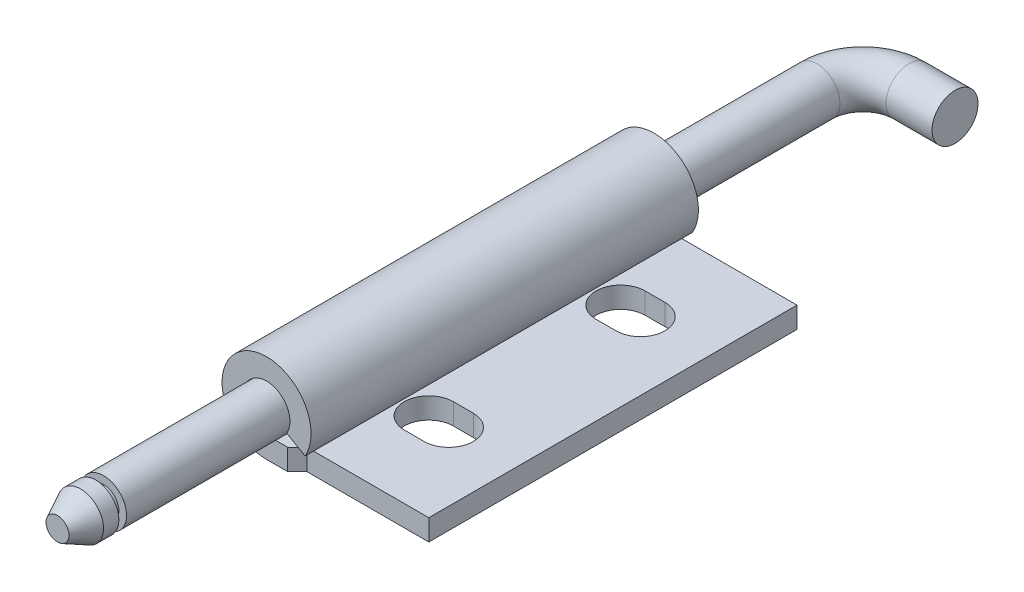
ISO-10303-21;
HEADER;
FILE_DESCRIPTION(('STEP AP214'),'2;1');
FILE_NAME('part.step','',(''),(''),'','','');
FILE_SCHEMA(('AUTOMOTIVE_DESIGN { 1 0 10303 214 1 1 1 1 }'));
ENDSEC;
DATA;
#1=APPLICATION_CONTEXT('core data for automotive mechanical design processes');
#2=APPLICATION_PROTOCOL_DEFINITION('international standard','automotive_design',2000,#1);
#3=PRODUCT_CONTEXT('',#1,'mechanical');
#4=PRODUCT('Part','Part','',(#3));
#5=PRODUCT_RELATED_PRODUCT_CATEGORY('part','',(#4));
#6=PRODUCT_DEFINITION_FORMATION('','',#4);
#7=PRODUCT_DEFINITION_CONTEXT('part definition',#1,'design');
#8=PRODUCT_DEFINITION('design','',#6,#7);
#9=PRODUCT_DEFINITION_SHAPE('','',#8);
#10=(LENGTH_UNIT() NAMED_UNIT(*) SI_UNIT(.MILLI.,.METRE.));
#11=(NAMED_UNIT(*) PLANE_ANGLE_UNIT() SI_UNIT($,.RADIAN.));
#12=(NAMED_UNIT(*) SI_UNIT($,.STERADIAN.) SOLID_ANGLE_UNIT());
#13=UNCERTAINTY_MEASURE_WITH_UNIT(LENGTH_MEASURE(1.E-05),#10,'distance_accuracy_value','');
#14=(GEOMETRIC_REPRESENTATION_CONTEXT(3) GLOBAL_UNCERTAINTY_ASSIGNED_CONTEXT((#13)) GLOBAL_UNIT_ASSIGNED_CONTEXT((#10,
#11,#12)) REPRESENTATION_CONTEXT('',''));
#15=CARTESIAN_POINT('',(0.,0.,0.));
#16=DIRECTION('',(0.,0.,1.));
#17=DIRECTION('',(1.,0.,0.));
#18=AXIS2_PLACEMENT_3D('',#15,#16,#17);
#19=CARTESIAN_POINT('',(0.,0.,52.5));
#20=DIRECTION('',(0.,0.,-1.));
#21=DIRECTION('',(-1.,0.,0.));
#22=AXIS2_PLACEMENT_3D('',#19,#20,#21);
#23=PLANE('',#22);
#24=CARTESIAN_POINT('',(0.,0.,52.5000000000091));
#25=DIRECTION('',(0.,0.,-1.));
#26=DIRECTION('',(-1.,0.,0.));
#27=AXIS2_PLACEMENT_3D('',#24,#25,#26);
#28=CIRCLE('',#27,1.49999999996453);
#29=CARTESIAN_POINT('',(-1.49999999996453,0.,52.5000000000091));
#30=VERTEX_POINT('',#29);
#31=EDGE_CURVE('E20',#30,#30,#28,.T.);
#32=ORIENTED_EDGE('',*,*,#31,.F.);
#33=EDGE_LOOP('',(#32));
#34=FACE_BOUND('',#33,.T.);
#35=ADVANCED_FACE('F16',(#34),#23,.F.);
#36=CARTESIAN_POINT('',(0.,0.,49.5000000002506));
#37=DIRECTION('',(0.,0.,-1.));
#38=DIRECTION('',(-1.,0.,0.));
#39=AXIS2_PLACEMENT_3D('',#36,#37,#38);
#40=CONICAL_SURFACE('',#39,2.99999999984379,0.463647609000806);
#41=CARTESIAN_POINT('',(0.,0.,49.5));
#42=DIRECTION('',(0.,0.,1.));
#43=DIRECTION('',(1.,0.,0.));
#44=AXIS2_PLACEMENT_3D('',#41,#42,#43);
#45=CIRCLE('',#44,3.);
#46=CARTESIAN_POINT('',(3.,0.,49.5));
#47=VERTEX_POINT('',#46);
#48=EDGE_CURVE('E180',#47,#47,#45,.F.);
#49=ORIENTED_EDGE('',*,*,#48,.F.);
#50=EDGE_LOOP('',(#49));
#51=FACE_BOUND('',#50,.T.);
#52=ORIENTED_EDGE('',*,*,#31,.T.);
#53=EDGE_LOOP('',(#52));
#54=FACE_BOUND('',#53,.T.);
#55=ADVANCED_FACE('F560',(#51,#54),#40,.T.);
#56=CARTESIAN_POINT('',(0.,0.,-46.5));
#57=DIRECTION('',(0.,0.,1.));
#58=DIRECTION('',(1.,0.,0.));
#59=AXIS2_PLACEMENT_3D('',#56,#57,#58);
#60=CYLINDRICAL_SURFACE('',#59,3.);
#61=ORIENTED_EDGE('',*,*,#48,.T.);
#62=EDGE_LOOP('',(#61));
#63=FACE_BOUND('',#62,.T.);
#64=CARTESIAN_POINT('',(0.,0.,47.5));
#65=DIRECTION('',(0.,0.,1.));
#66=DIRECTION('',(1.,0.,0.));
#67=AXIS2_PLACEMENT_3D('',#64,#65,#66);
#68=CIRCLE('',#67,3.);
#69=CARTESIAN_POINT('',(3.,0.,47.5));
#70=VERTEX_POINT('',#69);
#71=EDGE_CURVE('E182',#70,#70,#68,.T.);
#72=ORIENTED_EDGE('',*,*,#71,.T.);
#73=EDGE_LOOP('',(#72));
#74=FACE_BOUND('',#73,.T.);
#75=ADVANCED_FACE('F242',(#63,#74),#60,.T.);
#76=CARTESIAN_POINT('',(-3.,0.,47.5));
#77=DIRECTION('',(0.,0.,1.));
#78=DIRECTION('',(1.,0.,0.));
#79=AXIS2_PLACEMENT_3D('',#76,#77,#78);
#80=PLANE('',#79);
#81=ORIENTED_EDGE('',*,*,#71,.F.);
#82=EDGE_LOOP('',(#81));
#83=FACE_BOUND('',#82,.T.);
#84=CARTESIAN_POINT('',(0.,0.,47.5));
#85=DIRECTION('',(0.,0.,1.));
#86=DIRECTION('',(1.,0.,0.));
#87=AXIS2_PLACEMENT_3D('',#84,#85,#86);
#88=CIRCLE('',#87,2.);
#89=CARTESIAN_POINT('',(2.,0.,47.5));
#90=VERTEX_POINT('',#89);
#91=EDGE_CURVE('E237',#90,#90,#88,.F.);
#92=ORIENTED_EDGE('',*,*,#91,.F.);
#93=EDGE_LOOP('',(#92));
#94=FACE_BOUND('',#93,.T.);
#95=ADVANCED_FACE('F244',(#83,#94),#80,.F.);
#96=CARTESIAN_POINT('',(12.,0.,-52.5));
#97=DIRECTION('',(1.,0.,0.));
#98=DIRECTION('',(0.,0.,-1.));
#99=AXIS2_PLACEMENT_3D('',#96,#97,#98);
#100=PLANE('',#99);
#101=CARTESIAN_POINT('',(12.,0.,-52.5));
#102=DIRECTION('',(-1.,0.,0.));
#103=DIRECTION('',(0.,0.,1.));
#104=AXIS2_PLACEMENT_3D('',#101,#102,#103);
#105=CIRCLE('',#104,3.);
#106=CARTESIAN_POINT('',(12.,0.,-49.5));
#107=VERTEX_POINT('',#106);
#108=EDGE_CURVE('E234',#107,#107,#105,.T.);
#109=ORIENTED_EDGE('',*,*,#108,.F.);
#110=EDGE_LOOP('',(#109));
#111=FACE_BOUND('',#110,.T.);
#112=ADVANCED_FACE('F247',(#111),#100,.T.);
#113=CARTESIAN_POINT('',(0.,0.,-46.5));
#114=DIRECTION('',(0.,0.,1.));
#115=DIRECTION('',(1.,0.,0.));
#116=AXIS2_PLACEMENT_3D('',#113,#114,#115);
#117=CYLINDRICAL_SURFACE('',#116,2.);
#118=ORIENTED_EDGE('',*,*,#91,.T.);
#119=EDGE_LOOP('',(#118));
#120=FACE_BOUND('',#119,.T.);
#121=CARTESIAN_POINT('',(0.,0.,46.5));
#122=DIRECTION('',(0.,0.,1.));
#123=DIRECTION('',(1.,0.,0.));
#124=AXIS2_PLACEMENT_3D('',#121,#122,#123);
#125=CIRCLE('',#124,2.);
#126=CARTESIAN_POINT('',(2.,0.,46.5));
#127=VERTEX_POINT('',#126);
#128=EDGE_CURVE('E179',#127,#127,#125,.T.);
#129=ORIENTED_EDGE('',*,*,#128,.T.);
#130=EDGE_LOOP('',(#129));
#131=FACE_BOUND('',#130,.T.);
#132=ADVANCED_FACE('F251',(#120,#131),#117,.T.);
#133=CARTESIAN_POINT('',(12.,0.,-52.5));
#134=DIRECTION('',(-1.,0.,0.));
#135=DIRECTION('',(0.,0.,1.));
#136=AXIS2_PLACEMENT_3D('',#133,#134,#135);
#137=CYLINDRICAL_SURFACE('',#136,3.);
#138=CARTESIAN_POINT('',(6.,0.,-52.5));
#139=DIRECTION('',(-1.,0.,0.));
#140=DIRECTION('',(0.,0.,1.));
#141=AXIS2_PLACEMENT_3D('',#138,#139,#140);
#142=CIRCLE('',#141,3.);
#143=CARTESIAN_POINT('',(6.,0.,-55.5));
#144=VERTEX_POINT('',#143);
#145=EDGE_CURVE('E173',#144,#144,#142,.T.);
#146=ORIENTED_EDGE('',*,*,#145,.F.);
#147=EDGE_LOOP('',(#146));
#148=FACE_BOUND('',#147,.T.);
#149=ORIENTED_EDGE('',*,*,#108,.T.);
#150=EDGE_LOOP('',(#149));
#151=FACE_BOUND('',#150,.T.);
#152=ADVANCED_FACE('F254',(#148,#151),#137,.T.);
#153=CARTESIAN_POINT('',(-2.,0.,46.5));
#154=DIRECTION('',(0.,0.,-1.));
#155=DIRECTION('',(-1.,0.,0.));
#156=AXIS2_PLACEMENT_3D('',#153,#154,#155);
#157=PLANE('',#156);
#158=ORIENTED_EDGE('',*,*,#128,.F.);
#159=EDGE_LOOP('',(#158));
#160=FACE_BOUND('',#159,.T.);
#161=CARTESIAN_POINT('',(0.,0.,46.5));
#162=DIRECTION('',(0.,0.,1.));
#163=DIRECTION('',(1.,0.,0.));
#164=AXIS2_PLACEMENT_3D('',#161,#162,#163);
#165=CIRCLE('',#164,3.);
#166=CARTESIAN_POINT('',(3.,0.,46.5));
#167=VERTEX_POINT('',#166);
#168=EDGE_CURVE('E172',#167,#167,#165,.F.);
#169=ORIENTED_EDGE('',*,*,#168,.F.);
#170=EDGE_LOOP('',(#169));
#171=FACE_BOUND('',#170,.T.);
#172=ADVANCED_FACE('F258',(#160,#171),#157,.F.);
#173=CARTESIAN_POINT('',(6.,0.,-46.5));
#174=DIRECTION('',(0.,1.,0.));
#175=DIRECTION('',(-1.,0.,0.));
#176=AXIS2_PLACEMENT_3D('',#173,#174,#175);
#177=TOROIDAL_SURFACE('',#176,5.99999999999999,3.);
#178=CARTESIAN_POINT('',(0.,0.,-46.5));
#179=DIRECTION('',(0.,0.,1.));
#180=DIRECTION('',(1.,0.,0.));
#181=AXIS2_PLACEMENT_3D('',#178,#179,#180);
#182=CIRCLE('',#181,3.);
#183=CARTESIAN_POINT('',(-3.,0.,-46.5));
#184=VERTEX_POINT('',#183);
#185=EDGE_CURVE('E174',#184,#184,#182,.T.);
#186=CARTESIAN_POINT('',(6.,0.,-46.5));
#187=DIRECTION('',(0.,1.,0.));
#188=DIRECTION('',(-1.,0.,0.));
#189=AXIS2_PLACEMENT_3D('',#186,#187,#188);
#190=CIRCLE('',#189,8.99999999999999);
#191=EDGE_CURVE('',#144,#184,#190,.T.);
#192=ORIENTED_EDGE('',*,*,#145,.T.);
#193=ORIENTED_EDGE('',*,*,#185,.F.);
#194=ORIENTED_EDGE('',*,*,#191,.T.);
#195=ORIENTED_EDGE('',*,*,#191,.F.);
#196=EDGE_LOOP('',(#192,#194,#193,#195));
#197=FACE_BOUND('',#196,.T.);
#198=ADVANCED_FACE('F18',(#197),#177,.T.);
#199=CARTESIAN_POINT('',(0.,0.,-46.5));
#200=DIRECTION('',(0.,0.,1.));
#201=DIRECTION('',(1.,0.,0.));
#202=AXIS2_PLACEMENT_3D('',#199,#200,#201);
#203=CYLINDRICAL_SURFACE('',#202,3.);
#204=ORIENTED_EDGE('',*,*,#168,.T.);
#205=EDGE_LOOP('',(#204));
#206=FACE_BOUND('',#205,.T.);
#207=DIRECTION('',(0.,0.,1.));
#208=VECTOR('',#207,1.);
#209=CARTESIAN_POINT('',(0.,-3.,0.1));
#210=LINE('',#209,#208);
#211=CARTESIAN_POINT('',(0.,-3.,0.100000000000001));
#212=VERTEX_POINT('',#211);
#213=CARTESIAN_POINT('',(0.,-3.,-0.100000000000001));
#214=VERTEX_POINT('',#213);
#215=EDGE_CURVE('E143',#212,#214,#210,.F.);
#216=ORIENTED_EDGE('',*,*,#215,.T.);
#217=CARTESIAN_POINT('',(0.,0.,-0.100000000000003));
#218=DIRECTION('',(0.,0.,1.));
#219=DIRECTION('',(1.,0.,0.));
#220=AXIS2_PLACEMENT_3D('',#217,#218,#219);
#221=CIRCLE('',#220,3.);
#222=CARTESIAN_POINT('',(2.59807621135332,-1.5,-0.100000000000002));
#223=VERTEX_POINT('',#222);
#224=EDGE_CURVE('E163',#214,#223,#221,.F.);
#225=ORIENTED_EDGE('',*,*,#224,.T.);
#226=DIRECTION('',(0.,0.,1.));
#227=VECTOR('',#226,1.);
#228=CARTESIAN_POINT('',(2.59807621135332,-1.5,-46.5));
#229=LINE('',#228,#227);
#230=CARTESIAN_POINT('',(2.59807621135332,-1.5,0.0999999999999987));
#231=VERTEX_POINT('',#230);
#232=EDGE_CURVE('E146',#223,#231,#229,.T.);
#233=ORIENTED_EDGE('',*,*,#232,.T.);
#234=CARTESIAN_POINT('',(0.,0.,0.0999999999999959));
#235=DIRECTION('',(0.,0.,1.));
#236=DIRECTION('',(1.,0.,0.));
#237=AXIS2_PLACEMENT_3D('',#234,#235,#236);
#238=CIRCLE('',#237,3.);
#239=EDGE_CURVE('E137',#212,#231,#238,.F.);
#240=ORIENTED_EDGE('',*,*,#239,.F.);
#241=EDGE_LOOP('',(#216,#225,#233,#240));
#242=FACE_BOUND('',#241,.T.);
#243=ORIENTED_EDGE('',*,*,#185,.T.);
#244=EDGE_LOOP('',(#243));
#245=FACE_BOUND('',#244,.T.);
#246=ADVANCED_FACE('F139',(#206,#242,#245),#203,.T.);
#247=CARTESIAN_POINT('',(0.,0.,0.1));
#248=DIRECTION('',(0.,0.,1.));
#249=DIRECTION('',(1.,0.,0.));
#250=AXIS2_PLACEMENT_3D('',#247,#248,#249);
#251=PLANE('',#250);
#252=DIRECTION('',(0.,1.,0.));
#253=VECTOR('',#252,1.);
#254=CARTESIAN_POINT('',(0.,-5.8,0.0999999999999994));
#255=LINE('',#254,#253);
#256=CARTESIAN_POINT('',(0.,-3.05,0.0999999999999994));
#257=VERTEX_POINT('',#256);
#258=EDGE_CURVE('E149',#257,#212,#255,.T.);
#259=ORIENTED_EDGE('',*,*,#258,.T.);
#260=ORIENTED_EDGE('',*,*,#239,.T.);
#261=DIRECTION('',(0.866025403784438,-0.5,0.));
#262=VECTOR('',#261,1.);
#263=CARTESIAN_POINT('',(2.59807621135332,-1.5,0.1));
#264=LINE('',#263,#262);
#265=CARTESIAN_POINT('',(2.64137748154254,-1.525,0.0999999999999995));
#266=VERTEX_POINT('',#265);
#267=EDGE_CURVE('E150',#231,#266,#264,.T.);
#268=ORIENTED_EDGE('',*,*,#267,.T.);
#269=CARTESIAN_POINT('',(0.,0.,0.0999999999999994));
#270=DIRECTION('',(0.,0.,-1.));
#271=DIRECTION('',(-1.,0.,0.));
#272=AXIS2_PLACEMENT_3D('',#269,#270,#271);
#273=CIRCLE('',#272,3.05);
#274=EDGE_CURVE('E154',#266,#257,#273,.F.);
#275=ORIENTED_EDGE('',*,*,#274,.T.);
#276=EDGE_LOOP('',(#259,#260,#268,#275));
#277=FACE_BOUND('',#276,.T.);
#278=ADVANCED_FACE('F153',(#277),#251,.T.);
#279=CARTESIAN_POINT('',(0.,-5.8,0.1));
#280=DIRECTION('',(-1.,0.,0.));
#281=DIRECTION('',(0.,0.,1.));
#282=AXIS2_PLACEMENT_3D('',#279,#280,#281);
#283=PLANE('',#282);
#284=DIRECTION('',(0.,1.,0.));
#285=VECTOR('',#284,1.);
#286=CARTESIAN_POINT('',(0.,0.,-0.1));
#287=LINE('',#286,#285);
#288=CARTESIAN_POINT('',(0.,-3.05,-0.0999999999999995));
#289=VERTEX_POINT('',#288);
#290=EDGE_CURVE('E162',#289,#214,#287,.T.);
#291=ORIENTED_EDGE('',*,*,#290,.T.);
#292=ORIENTED_EDGE('',*,*,#215,.F.);
#293=ORIENTED_EDGE('',*,*,#258,.F.);
#294=DIRECTION('',(0.,0.,1.));
#295=VECTOR('',#294,1.);
#296=CARTESIAN_POINT('',(0.,-3.05,25.25));
#297=LINE('',#296,#295);
#298=EDGE_CURVE('E618',#257,#289,#297,.F.);
#299=ORIENTED_EDGE('',*,*,#298,.T.);
#300=EDGE_LOOP('',(#291,#292,#293,#299));
#301=FACE_BOUND('',#300,.T.);
#302=ADVANCED_FACE('F160',(#301),#283,.F.);
#303=CARTESIAN_POINT('',(0.,0.,-0.1));
#304=DIRECTION('',(0.,0.,1.));
#305=DIRECTION('',(1.,0.,0.));
#306=AXIS2_PLACEMENT_3D('',#303,#304,#305);
#307=PLANE('',#306);
#308=ORIENTED_EDGE('',*,*,#290,.F.);
#309=CARTESIAN_POINT('',(0.,0.,-0.0999999999999994));
#310=DIRECTION('',(0.,0.,-1.));
#311=DIRECTION('',(-1.,0.,0.));
#312=AXIS2_PLACEMENT_3D('',#309,#310,#311);
#313=CIRCLE('',#312,3.05);
#314=CARTESIAN_POINT('',(2.64137748154254,-1.525,-0.0999999999999995));
#315=VERTEX_POINT('',#314);
#316=EDGE_CURVE('E207',#289,#315,#313,.T.);
#317=ORIENTED_EDGE('',*,*,#316,.T.);
#318=DIRECTION('',(0.866025403784446,-0.499999999999986,0.));
#319=VECTOR('',#318,1.);
#320=CARTESIAN_POINT('',(2.59807621135332,-1.5,-0.1));
#321=LINE('',#320,#319);
#322=EDGE_CURVE('E165',#223,#315,#321,.T.);
#323=ORIENTED_EDGE('',*,*,#322,.F.);
#324=ORIENTED_EDGE('',*,*,#224,.F.);
#325=EDGE_LOOP('',(#308,#317,#323,#324));
#326=FACE_BOUND('',#325,.T.);
#327=ADVANCED_FACE('F358',(#326),#307,.F.);
#328=CARTESIAN_POINT('',(4.,-9.00000000000001,24.));
#329=DIRECTION('',(0.,0.,1.));
#330=DIRECTION('',(1.,0.,0.));
#331=AXIS2_PLACEMENT_3D('',#328,#329,#330);
#332=PLANE('',#331);
#333=DIRECTION('',(-1.,0.,0.));
#334=VECTOR('',#333,1.);
#335=CARTESIAN_POINT('',(0.,-5.8,24.));
#336=LINE('',#335,#334);
#337=CARTESIAN_POINT('',(4.,-5.8,24.));
#338=VERTEX_POINT('',#337);
#339=CARTESIAN_POINT('',(19.9,-5.8,24.));
#340=VERTEX_POINT('',#339);
#341=EDGE_CURVE('E648',#338,#340,#336,.F.);
#342=ORIENTED_EDGE('',*,*,#341,.T.);
#343=DIRECTION('',(0.,1.,0.));
#344=VECTOR('',#343,1.);
#345=CARTESIAN_POINT('',(19.9,-5.80000000000001,24.));
#346=LINE('',#345,#344);
#347=CARTESIAN_POINT('',(19.9,-3.05000000000001,24.));
#348=VERTEX_POINT('',#347);
#349=EDGE_CURVE('E608',#340,#348,#346,.T.);
#350=ORIENTED_EDGE('',*,*,#349,.T.);
#351=DIRECTION('',(1.,0.,0.));
#352=VECTOR('',#351,1.);
#353=CARTESIAN_POINT('',(19.9,-3.05000000000001,24.));
#354=LINE('',#353,#352);
#355=CARTESIAN_POINT('',(4.,-3.05,24.));
#356=VERTEX_POINT('',#355);
#357=EDGE_CURVE('E621',#348,#356,#354,.F.);
#358=ORIENTED_EDGE('',*,*,#357,.T.);
#359=DIRECTION('',(0.,1.,0.));
#360=VECTOR('',#359,1.);
#361=CARTESIAN_POINT('',(4.,-9.00000000000001,24.));
#362=LINE('',#361,#360);
#363=EDGE_CURVE('E227',#338,#356,#362,.T.);
#364=ORIENTED_EDGE('',*,*,#363,.F.);
#365=EDGE_LOOP('',(#342,#350,#358,#364));
#366=FACE_BOUND('',#365,.T.);
#367=ADVANCED_FACE('F354',(#366),#332,.T.);
#368=CARTESIAN_POINT('',(19.9,-5.80000000000001,25.25));
#369=DIRECTION('',(-1.,0.,0.));
#370=DIRECTION('',(0.,0.,1.));
#371=AXIS2_PLACEMENT_3D('',#368,#369,#370);
#372=PLANE('',#371);
#373=ORIENTED_EDGE('',*,*,#349,.F.);
#374=DIRECTION('',(0.,0.,1.));
#375=VECTOR('',#374,1.);
#376=CARTESIAN_POINT('',(19.9,-5.80000000000001,25.25));
#377=LINE('',#376,#375);
#378=CARTESIAN_POINT('',(19.9,-5.80000000000001,-24.));
#379=VERTEX_POINT('',#378);
#380=EDGE_CURVE('E645',#340,#379,#377,.F.);
#381=ORIENTED_EDGE('',*,*,#380,.T.);
#382=DIRECTION('',(0.,1.,0.));
#383=VECTOR('',#382,1.);
#384=CARTESIAN_POINT('',(19.9,-9.00000000000001,-24.));
#385=LINE('',#384,#383);
#386=CARTESIAN_POINT('',(19.9,-3.05,-24.));
#387=VERTEX_POINT('',#386);
#388=EDGE_CURVE('E611',#387,#379,#385,.F.);
#389=ORIENTED_EDGE('',*,*,#388,.F.);
#390=DIRECTION('',(0.,0.,1.));
#391=VECTOR('',#390,1.);
#392=CARTESIAN_POINT('',(19.9,-3.05000000000001,25.25));
#393=LINE('',#392,#391);
#394=EDGE_CURVE('E625',#387,#348,#393,.T.);
#395=ORIENTED_EDGE('',*,*,#394,.T.);
#396=EDGE_LOOP('',(#373,#381,#389,#395));
#397=FACE_BOUND('',#396,.T.);
#398=ADVANCED_FACE('F350',(#397),#372,.F.);
#399=CARTESIAN_POINT('',(19.9,-9.00000000000001,-24.));
#400=DIRECTION('',(0.,0.,-1.));
#401=DIRECTION('',(-1.,0.,0.));
#402=AXIS2_PLACEMENT_3D('',#399,#400,#401);
#403=PLANE('',#402);
#404=DIRECTION('',(-1.,0.,0.));
#405=VECTOR('',#404,1.);
#406=CARTESIAN_POINT('',(0.,-5.8,-24.));
#407=LINE('',#406,#405);
#408=CARTESIAN_POINT('',(4.,-5.8,-24.));
#409=VERTEX_POINT('',#408);
#410=EDGE_CURVE('E647',#379,#409,#407,.T.);
#411=ORIENTED_EDGE('',*,*,#410,.T.);
#412=DIRECTION('',(0.,1.,0.));
#413=VECTOR('',#412,1.);
#414=CARTESIAN_POINT('',(4.,-9.00000000000001,-24.));
#415=LINE('',#414,#413);
#416=CARTESIAN_POINT('',(4.,-3.05,-24.));
#417=VERTEX_POINT('',#416);
#418=EDGE_CURVE('E667',#417,#409,#415,.F.);
#419=ORIENTED_EDGE('',*,*,#418,.F.);
#420=DIRECTION('',(1.,0.,0.));
#421=VECTOR('',#420,1.);
#422=CARTESIAN_POINT('',(19.9,-3.05000000000001,-24.));
#423=LINE('',#422,#421);
#424=EDGE_CURVE('E630',#417,#387,#423,.T.);
#425=ORIENTED_EDGE('',*,*,#424,.T.);
#426=ORIENTED_EDGE('',*,*,#388,.T.);
#427=EDGE_LOOP('',(#411,#419,#425,#426));
#428=FACE_BOUND('',#427,.T.);
#429=ADVANCED_FACE('F346',(#428),#403,.T.);
#430=CARTESIAN_POINT('',(11.,-9.00000000000001,9.3));
#431=DIRECTION('',(0.,0.,-1.));
#432=DIRECTION('',(-1.,0.,0.));
#433=AXIS2_PLACEMENT_3D('',#430,#431,#432);
#434=PLANE('',#433);
#435=DIRECTION('',(0.,1.,0.));
#436=VECTOR('',#435,1.);
#437=CARTESIAN_POINT('',(8.4,-9.00000000000001,9.3));
#438=LINE('',#437,#436);
#439=CARTESIAN_POINT('',(8.4,-3.05,9.3));
#440=VERTEX_POINT('',#439);
#441=CARTESIAN_POINT('',(8.4,-5.8,9.3));
#442=VERTEX_POINT('',#441);
#443=EDGE_CURVE('E682',#440,#442,#438,.F.);
#444=ORIENTED_EDGE('',*,*,#443,.T.);
#445=DIRECTION('',(-1.,0.,0.));
#446=VECTOR('',#445,1.);
#447=CARTESIAN_POINT('',(0.,-5.8,9.3));
#448=LINE('',#447,#446);
#449=CARTESIAN_POINT('',(11.,-5.8,9.3));
#450=VERTEX_POINT('',#449);
#451=EDGE_CURVE('E206',#442,#450,#448,.F.);
#452=ORIENTED_EDGE('',*,*,#451,.T.);
#453=DIRECTION('',(0.,1.,0.));
#454=VECTOR('',#453,1.);
#455=CARTESIAN_POINT('',(11.,-9.00000000000001,9.3));
#456=LINE('',#455,#454);
#457=CARTESIAN_POINT('',(11.,-3.05,9.3));
#458=VERTEX_POINT('',#457);
#459=EDGE_CURVE('E642',#450,#458,#456,.T.);
#460=ORIENTED_EDGE('',*,*,#459,.T.);
#461=DIRECTION('',(1.,0.,0.));
#462=VECTOR('',#461,1.);
#463=CARTESIAN_POINT('',(19.9,-3.05000000000001,9.3));
#464=LINE('',#463,#462);
#465=EDGE_CURVE('E222',#458,#440,#464,.F.);
#466=ORIENTED_EDGE('',*,*,#465,.T.);
#467=EDGE_LOOP('',(#444,#452,#460,#466));
#468=FACE_BOUND('',#467,.T.);
#469=ADVANCED_FACE('F342',(#468),#434,.F.);
#470=CARTESIAN_POINT('',(11.,-9.00000000000001,12.5));
#471=DIRECTION('',(0.,1.,0.));
#472=DIRECTION('',(0.,0.,1.));
#473=AXIS2_PLACEMENT_3D('',#470,#471,#472);
#474=CYLINDRICAL_SURFACE('',#473,3.2);
#475=ORIENTED_EDGE('',*,*,#459,.F.);
#476=CARTESIAN_POINT('',(11.,-5.8,12.5));
#477=DIRECTION('',(0.,1.,0.));
#478=DIRECTION('',(0.,0.,1.));
#479=AXIS2_PLACEMENT_3D('',#476,#477,#478);
#480=CIRCLE('',#479,3.2);
#481=CARTESIAN_POINT('',(11.,-5.8,15.7));
#482=VERTEX_POINT('',#481);
#483=EDGE_CURVE('E204',#450,#482,#480,.F.);
#484=ORIENTED_EDGE('',*,*,#483,.T.);
#485=DIRECTION('',(0.,1.,0.));
#486=VECTOR('',#485,1.);
#487=CARTESIAN_POINT('',(11.,-9.00000000000001,15.7));
#488=LINE('',#487,#486);
#489=CARTESIAN_POINT('',(11.,-3.05,15.7));
#490=VERTEX_POINT('',#489);
#491=EDGE_CURVE('E680',#482,#490,#488,.T.);
#492=ORIENTED_EDGE('',*,*,#491,.T.);
#493=CARTESIAN_POINT('',(11.,-3.05,12.5));
#494=DIRECTION('',(0.,1.,0.));
#495=DIRECTION('',(0.,0.,1.));
#496=AXIS2_PLACEMENT_3D('',#493,#494,#495);
#497=CIRCLE('',#496,3.2);
#498=EDGE_CURVE('E223',#490,#458,#497,.T.);
#499=ORIENTED_EDGE('',*,*,#498,.T.);
#500=EDGE_LOOP('',(#475,#484,#492,#499));
#501=FACE_BOUND('',#500,.T.);
#502=ADVANCED_FACE('F338',(#501),#474,.F.);
#503=CARTESIAN_POINT('',(8.4,-9.00000000000001,15.7));
#504=DIRECTION('',(0.,0.,1.));
#505=DIRECTION('',(1.,0.,0.));
#506=AXIS2_PLACEMENT_3D('',#503,#504,#505);
#507=PLANE('',#506);
#508=ORIENTED_EDGE('',*,*,#491,.F.);
#509=DIRECTION('',(-1.,0.,0.));
#510=VECTOR('',#509,1.);
#511=CARTESIAN_POINT('',(0.,-5.8,15.7));
#512=LINE('',#511,#510);
#513=CARTESIAN_POINT('',(8.4,-5.8,15.7));
#514=VERTEX_POINT('',#513);
#515=EDGE_CURVE('E203',#482,#514,#512,.T.);
#516=ORIENTED_EDGE('',*,*,#515,.T.);
#517=DIRECTION('',(0.,1.,0.));
#518=VECTOR('',#517,1.);
#519=CARTESIAN_POINT('',(8.4,-9.00000000000001,15.7));
#520=LINE('',#519,#518);
#521=CARTESIAN_POINT('',(8.4,-3.05,15.7));
#522=VERTEX_POINT('',#521);
#523=EDGE_CURVE('E683',#514,#522,#520,.T.);
#524=ORIENTED_EDGE('',*,*,#523,.T.);
#525=DIRECTION('',(1.,0.,0.));
#526=VECTOR('',#525,1.);
#527=CARTESIAN_POINT('',(19.9,-3.05000000000001,15.7));
#528=LINE('',#527,#526);
#529=EDGE_CURVE('E226',#522,#490,#528,.T.);
#530=ORIENTED_EDGE('',*,*,#529,.T.);
#531=EDGE_LOOP('',(#508,#516,#524,#530));
#532=FACE_BOUND('',#531,.T.);
#533=ADVANCED_FACE('F334',(#532),#507,.F.);
#534=CARTESIAN_POINT('',(8.4,-9.00000000000001,12.5));
#535=DIRECTION('',(0.,1.,0.));
#536=DIRECTION('',(0.,0.,1.));
#537=AXIS2_PLACEMENT_3D('',#534,#535,#536);
#538=CYLINDRICAL_SURFACE('',#537,3.2);
#539=ORIENTED_EDGE('',*,*,#523,.F.);
#540=CARTESIAN_POINT('',(8.4,-5.8,12.5));
#541=DIRECTION('',(0.,1.,0.));
#542=DIRECTION('',(0.,0.,1.));
#543=AXIS2_PLACEMENT_3D('',#540,#541,#542);
#544=CIRCLE('',#543,3.2);
#545=EDGE_CURVE('E200',#514,#442,#544,.F.);
#546=ORIENTED_EDGE('',*,*,#545,.T.);
#547=ORIENTED_EDGE('',*,*,#443,.F.);
#548=CARTESIAN_POINT('',(8.4,-3.05,12.5));
#549=DIRECTION('',(0.,1.,0.));
#550=DIRECTION('',(0.,0.,1.));
#551=AXIS2_PLACEMENT_3D('',#548,#549,#550);
#552=CIRCLE('',#551,3.2);
#553=EDGE_CURVE('E219',#440,#522,#552,.T.);
#554=ORIENTED_EDGE('',*,*,#553,.T.);
#555=EDGE_LOOP('',(#539,#546,#547,#554));
#556=FACE_BOUND('',#555,.T.);
#557=ADVANCED_FACE('F330',(#556),#538,.F.);
#558=CARTESIAN_POINT('',(11.,-9.00000000000001,-15.7));
#559=DIRECTION('',(0.,0.,-1.));
#560=DIRECTION('',(-1.,0.,0.));
#561=AXIS2_PLACEMENT_3D('',#558,#559,#560);
#562=PLANE('',#561);
#563=DIRECTION('',(0.,1.,0.));
#564=VECTOR('',#563,1.);
#565=CARTESIAN_POINT('',(8.4,-9.00000000000001,-15.7));
#566=LINE('',#565,#564);
#567=CARTESIAN_POINT('',(8.4,-3.05,-15.7));
#568=VERTEX_POINT('',#567);
#569=CARTESIAN_POINT('',(8.4,-5.8,-15.7));
#570=VERTEX_POINT('',#569);
#571=EDGE_CURVE('E690',#568,#570,#566,.F.);
#572=ORIENTED_EDGE('',*,*,#571,.T.);
#573=DIRECTION('',(-1.,0.,0.));
#574=VECTOR('',#573,1.);
#575=CARTESIAN_POINT('',(0.,-5.8,-15.7));
#576=LINE('',#575,#574);
#577=CARTESIAN_POINT('',(11.,-5.8,-15.7));
#578=VERTEX_POINT('',#577);
#579=EDGE_CURVE('E199',#570,#578,#576,.F.);
#580=ORIENTED_EDGE('',*,*,#579,.T.);
#581=DIRECTION('',(0.,1.,0.));
#582=VECTOR('',#581,1.);
#583=CARTESIAN_POINT('',(11.,-9.00000000000001,-15.7));
#584=LINE('',#583,#582);
#585=CARTESIAN_POINT('',(11.,-3.05,-15.7));
#586=VERTEX_POINT('',#585);
#587=EDGE_CURVE('E685',#578,#586,#584,.T.);
#588=ORIENTED_EDGE('',*,*,#587,.T.);
#589=DIRECTION('',(1.,0.,0.));
#590=VECTOR('',#589,1.);
#591=CARTESIAN_POINT('',(19.9,-3.05000000000001,-15.7));
#592=LINE('',#591,#590);
#593=EDGE_CURVE('E214',#586,#568,#592,.F.);
#594=ORIENTED_EDGE('',*,*,#593,.T.);
#595=EDGE_LOOP('',(#572,#580,#588,#594));
#596=FACE_BOUND('',#595,.T.);
#597=ADVANCED_FACE('F326',(#596),#562,.F.);
#598=CARTESIAN_POINT('',(11.,-9.00000000000001,-12.5));
#599=DIRECTION('',(0.,1.,0.));
#600=DIRECTION('',(0.,0.,1.));
#601=AXIS2_PLACEMENT_3D('',#598,#599,#600);
#602=CYLINDRICAL_SURFACE('',#601,3.2);
#603=ORIENTED_EDGE('',*,*,#587,.F.);
#604=CARTESIAN_POINT('',(11.,-5.8,-12.5));
#605=DIRECTION('',(0.,1.,0.));
#606=DIRECTION('',(0.,0.,1.));
#607=AXIS2_PLACEMENT_3D('',#604,#605,#606);
#608=CIRCLE('',#607,3.2);
#609=CARTESIAN_POINT('',(11.,-5.8,-9.3));
#610=VERTEX_POINT('',#609);
#611=EDGE_CURVE('E197',#578,#610,#608,.F.);
#612=ORIENTED_EDGE('',*,*,#611,.T.);
#613=DIRECTION('',(0.,1.,0.));
#614=VECTOR('',#613,1.);
#615=CARTESIAN_POINT('',(11.,-9.00000000000001,-9.3));
#616=LINE('',#615,#614);
#617=CARTESIAN_POINT('',(11.,-3.05,-9.3));
#618=VERTEX_POINT('',#617);
#619=EDGE_CURVE('E688',#610,#618,#616,.T.);
#620=ORIENTED_EDGE('',*,*,#619,.T.);
#621=CARTESIAN_POINT('',(11.,-3.05,-12.5));
#622=DIRECTION('',(0.,1.,0.));
#623=DIRECTION('',(0.,0.,1.));
#624=AXIS2_PLACEMENT_3D('',#621,#622,#623);
#625=CIRCLE('',#624,3.2);
#626=EDGE_CURVE('E215',#618,#586,#625,.T.);
#627=ORIENTED_EDGE('',*,*,#626,.T.);
#628=EDGE_LOOP('',(#603,#612,#620,#627));
#629=FACE_BOUND('',#628,.T.);
#630=ADVANCED_FACE('F322',(#629),#602,.F.);
#631=CARTESIAN_POINT('',(8.4,-9.00000000000001,-9.3));
#632=DIRECTION('',(0.,0.,1.));
#633=DIRECTION('',(1.,0.,0.));
#634=AXIS2_PLACEMENT_3D('',#631,#632,#633);
#635=PLANE('',#634);
#636=ORIENTED_EDGE('',*,*,#619,.F.);
#637=DIRECTION('',(-1.,0.,0.));
#638=VECTOR('',#637,1.);
#639=CARTESIAN_POINT('',(0.,-5.8,-9.3));
#640=LINE('',#639,#638);
#641=CARTESIAN_POINT('',(8.4,-5.8,-9.3));
#642=VERTEX_POINT('',#641);
#643=EDGE_CURVE('E196',#610,#642,#640,.T.);
#644=ORIENTED_EDGE('',*,*,#643,.T.);
#645=DIRECTION('',(0.,1.,0.));
#646=VECTOR('',#645,1.);
#647=CARTESIAN_POINT('',(8.4,-9.00000000000001,-9.3));
#648=LINE('',#647,#646);
#649=CARTESIAN_POINT('',(8.4,-3.05,-9.3));
#650=VERTEX_POINT('',#649);
#651=EDGE_CURVE('E228',#642,#650,#648,.T.);
#652=ORIENTED_EDGE('',*,*,#651,.T.);
#653=DIRECTION('',(1.,0.,0.));
#654=VECTOR('',#653,1.);
#655=CARTESIAN_POINT('',(19.9,-3.05000000000001,-9.3));
#656=LINE('',#655,#654);
#657=EDGE_CURVE('E218',#650,#618,#656,.T.);
#658=ORIENTED_EDGE('',*,*,#657,.T.);
#659=EDGE_LOOP('',(#636,#644,#652,#658));
#660=FACE_BOUND('',#659,.T.);
#661=ADVANCED_FACE('F318',(#660),#635,.F.);
#662=CARTESIAN_POINT('',(8.4,-9.00000000000001,-12.5));
#663=DIRECTION('',(0.,1.,0.));
#664=DIRECTION('',(0.,0.,1.));
#665=AXIS2_PLACEMENT_3D('',#662,#663,#664);
#666=CYLINDRICAL_SURFACE('',#665,3.2);
#667=ORIENTED_EDGE('',*,*,#651,.F.);
#668=CARTESIAN_POINT('',(8.4,-5.8,-12.5));
#669=DIRECTION('',(0.,1.,0.));
#670=DIRECTION('',(0.,0.,1.));
#671=AXIS2_PLACEMENT_3D('',#668,#669,#670);
#672=CIRCLE('',#671,3.2);
#673=EDGE_CURVE('E193',#642,#570,#672,.F.);
#674=ORIENTED_EDGE('',*,*,#673,.T.);
#675=ORIENTED_EDGE('',*,*,#571,.F.);
#676=CARTESIAN_POINT('',(8.4,-3.05,-12.5));
#677=DIRECTION('',(0.,1.,0.));
#678=DIRECTION('',(0.,0.,1.));
#679=AXIS2_PLACEMENT_3D('',#676,#677,#678);
#680=CIRCLE('',#679,3.2);
#681=EDGE_CURVE('E211',#568,#650,#680,.T.);
#682=ORIENTED_EDGE('',*,*,#681,.T.);
#683=EDGE_LOOP('',(#667,#674,#675,#682));
#684=FACE_BOUND('',#683,.T.);
#685=ADVANCED_FACE('F314',(#684),#666,.F.);
#686=CARTESIAN_POINT('',(0.,0.,25.25));
#687=DIRECTION('',(0.,0.,-1.));
#688=DIRECTION('',(-1.,0.,0.));
#689=AXIS2_PLACEMENT_3D('',#686,#687,#688);
#690=CYLINDRICAL_SURFACE('',#689,3.05);
#691=CARTESIAN_POINT('',(0.,0.,25.25));
#692=DIRECTION('',(0.,0.,-1.));
#693=DIRECTION('',(-1.,0.,0.));
#694=AXIS2_PLACEMENT_3D('',#691,#692,#693);
#695=CIRCLE('',#694,3.05);
#696=CARTESIAN_POINT('',(0.,-3.05,25.25));
#697=VERTEX_POINT('',#696);
#698=CARTESIAN_POINT('',(2.64137748154254,-1.525,25.25));
#699=VERTEX_POINT('',#698);
#700=EDGE_CURVE('E190',#697,#699,#695,.T.);
#701=ORIENTED_EDGE('',*,*,#700,.F.);
#702=DIRECTION('',(0.,0.,1.));
#703=VECTOR('',#702,1.);
#704=CARTESIAN_POINT('',(0.,-3.05,25.25));
#705=LINE('',#704,#703);
#706=EDGE_CURVE('E619',#697,#257,#705,.F.);
#707=ORIENTED_EDGE('',*,*,#706,.T.);
#708=ORIENTED_EDGE('',*,*,#274,.F.);
#709=DIRECTION('',(0.,0.,1.));
#710=VECTOR('',#709,1.);
#711=CARTESIAN_POINT('',(2.64137748154254,-1.525,25.25));
#712=LINE('',#711,#710);
#713=EDGE_CURVE('E209',#266,#699,#712,.T.);
#714=ORIENTED_EDGE('',*,*,#713,.T.);
#715=EDGE_LOOP('',(#701,#707,#708,#714));
#716=FACE_BOUND('',#715,.T.);
#717=ADVANCED_FACE('F310',(#716),#690,.F.);
#718=CARTESIAN_POINT('',(2.75,-9.00000000000001,25.25));
#719=DIRECTION('',(0.707106781186548,0.,0.707106781186547));
#720=DIRECTION('',(0.707106781186547,0.,-0.707106781186548));
#721=AXIS2_PLACEMENT_3D('',#718,#719,#720);
#722=PLANE('',#721);
#723=DIRECTION('',(0.707106781186547,0.,-0.707106781186548));
#724=VECTOR('',#723,1.);
#725=CARTESIAN_POINT('',(2.75,-5.8,25.25));
#726=LINE('',#725,#724);
#727=CARTESIAN_POINT('',(2.75,-5.8,25.25));
#728=VERTEX_POINT('',#727);
#729=EDGE_CURVE('E654',#728,#338,#726,.T.);
#730=ORIENTED_EDGE('',*,*,#729,.T.);
#731=ORIENTED_EDGE('',*,*,#363,.T.);
#732=DIRECTION('',(-0.707106781186546,0.,0.707106781186548));
#733=VECTOR('',#732,1.);
#734=CARTESIAN_POINT('',(4.,-3.05,24.));
#735=LINE('',#734,#733);
#736=CARTESIAN_POINT('',(2.75,-3.05,25.25));
#737=VERTEX_POINT('',#736);
#738=EDGE_CURVE('E624',#356,#737,#735,.T.);
#739=ORIENTED_EDGE('',*,*,#738,.T.);
#740=DIRECTION('',(0.,1.,0.));
#741=VECTOR('',#740,1.);
#742=CARTESIAN_POINT('',(2.75,0.,25.25));
#743=LINE('',#742,#741);
#744=EDGE_CURVE('E700',#728,#737,#743,.T.);
#745=ORIENTED_EDGE('',*,*,#744,.F.);
#746=EDGE_LOOP('',(#730,#731,#739,#745));
#747=FACE_BOUND('',#746,.T.);
#748=ADVANCED_FACE('F306',(#747),#722,.T.);
#749=CARTESIAN_POINT('',(4.,-9.00000000000001,-24.));
#750=DIRECTION('',(0.707106781186548,0.,-0.707106781186547));
#751=DIRECTION('',(-0.707106781186547,0.,-0.707106781186548));
#752=AXIS2_PLACEMENT_3D('',#749,#750,#751);
#753=PLANE('',#752);
#754=DIRECTION('',(-0.707106781186547,0.,-0.707106781186547));
#755=VECTOR('',#754,1.);
#756=CARTESIAN_POINT('',(4.,-5.8,-24.));
#757=LINE('',#756,#755);
#758=CARTESIAN_POINT('',(2.75,-5.8,-25.25));
#759=VERTEX_POINT('',#758);
#760=EDGE_CURVE('E659',#409,#759,#757,.T.);
#761=ORIENTED_EDGE('',*,*,#760,.T.);
#762=DIRECTION('',(0.,1.,0.));
#763=VECTOR('',#762,1.);
#764=CARTESIAN_POINT('',(2.75,0.,-25.25));
#765=LINE('',#764,#763);
#766=CARTESIAN_POINT('',(2.75,-3.05,-25.25));
#767=VERTEX_POINT('',#766);
#768=EDGE_CURVE('E717',#759,#767,#765,.T.);
#769=ORIENTED_EDGE('',*,*,#768,.T.);
#770=DIRECTION('',(0.707106781186547,0.,0.707106781186547));
#771=VECTOR('',#770,1.);
#772=CARTESIAN_POINT('',(2.75,-3.05,-25.25));
#773=LINE('',#772,#771);
#774=EDGE_CURVE('E637',#767,#417,#773,.T.);
#775=ORIENTED_EDGE('',*,*,#774,.T.);
#776=ORIENTED_EDGE('',*,*,#418,.T.);
#777=EDGE_LOOP('',(#761,#769,#775,#776));
#778=FACE_BOUND('',#777,.T.);
#779=ADVANCED_FACE('F302',(#778),#753,.T.);
#780=CARTESIAN_POINT('',(19.9,-3.05000000000001,25.25));
#781=DIRECTION('',(0.,-1.,0.));
#782=DIRECTION('',(1.,0.,0.));
#783=AXIS2_PLACEMENT_3D('',#780,#781,#782);
#784=PLANE('',#783);
#785=ORIENTED_EDGE('',*,*,#593,.F.);
#786=ORIENTED_EDGE('',*,*,#626,.F.);
#787=ORIENTED_EDGE('',*,*,#657,.F.);
#788=ORIENTED_EDGE('',*,*,#681,.F.);
#789=EDGE_LOOP('',(#785,#786,#787,#788));
#790=FACE_BOUND('',#789,.T.);
#791=ORIENTED_EDGE('',*,*,#465,.F.);
#792=ORIENTED_EDGE('',*,*,#498,.F.);
#793=ORIENTED_EDGE('',*,*,#529,.F.);
#794=ORIENTED_EDGE('',*,*,#553,.F.);
#795=EDGE_LOOP('',(#791,#792,#793,#794));
#796=FACE_BOUND('',#795,.T.);
#797=DIRECTION('',(0.,0.,-1.));
#798=VECTOR('',#797,1.);
#799=CARTESIAN_POINT('',(0.,-3.05,25.25));
#800=LINE('',#799,#798);
#801=CARTESIAN_POINT('',(0.,-3.05,-25.25));
#802=VERTEX_POINT('',#801);
#803=EDGE_CURVE('E210',#802,#289,#800,.F.);
#804=ORIENTED_EDGE('',*,*,#803,.T.);
#805=ORIENTED_EDGE('',*,*,#298,.F.);
#806=ORIENTED_EDGE('',*,*,#706,.F.);
#807=DIRECTION('',(1.,0.,0.));
#808=VECTOR('',#807,1.);
#809=CARTESIAN_POINT('',(0.,-3.05,25.25));
#810=LINE('',#809,#808);
#811=EDGE_CURVE('E703',#737,#697,#810,.F.);
#812=ORIENTED_EDGE('',*,*,#811,.F.);
#813=ORIENTED_EDGE('',*,*,#738,.F.);
#814=ORIENTED_EDGE('',*,*,#357,.F.);
#815=ORIENTED_EDGE('',*,*,#394,.F.);
#816=ORIENTED_EDGE('',*,*,#424,.F.);
#817=ORIENTED_EDGE('',*,*,#774,.F.);
#818=DIRECTION('',(1.,0.,0.));
#819=VECTOR('',#818,1.);
#820=CARTESIAN_POINT('',(0.,-3.05,-25.25));
#821=LINE('',#820,#819);
#822=EDGE_CURVE('E189',#767,#802,#821,.F.);
#823=ORIENTED_EDGE('',*,*,#822,.T.);
#824=EDGE_LOOP('',(#804,#805,#806,#812,#813,#814,#815,#816,#817,#823));
#825=FACE_BOUND('',#824,.T.);
#826=ADVANCED_FACE('F298',(#790,#796,#825),#784,.F.);
#827=CARTESIAN_POINT('',(0.,0.,25.25));
#828=DIRECTION('',(0.,0.,-1.));
#829=DIRECTION('',(-1.,0.,0.));
#830=AXIS2_PLACEMENT_3D('',#827,#828,#829);
#831=CYLINDRICAL_SURFACE('',#830,3.05);
#832=ORIENTED_EDGE('',*,*,#316,.F.);
#833=ORIENTED_EDGE('',*,*,#803,.F.);
#834=CARTESIAN_POINT('',(0.,0.,-25.25));
#835=DIRECTION('',(0.,0.,-1.));
#836=DIRECTION('',(-1.,0.,0.));
#837=AXIS2_PLACEMENT_3D('',#834,#835,#836);
#838=CIRCLE('',#837,3.05);
#839=CARTESIAN_POINT('',(2.64137748154254,-1.525,-25.25));
#840=VERTEX_POINT('',#839);
#841=EDGE_CURVE('E186',#802,#840,#838,.T.);
#842=ORIENTED_EDGE('',*,*,#841,.T.);
#843=DIRECTION('',(0.,0.,1.));
#844=VECTOR('',#843,1.);
#845=CARTESIAN_POINT('',(2.64137748154254,-1.525,25.25));
#846=LINE('',#845,#844);
#847=EDGE_CURVE('E695',#840,#315,#846,.T.);
#848=ORIENTED_EDGE('',*,*,#847,.T.);
#849=EDGE_LOOP('',(#832,#833,#842,#848));
#850=FACE_BOUND('',#849,.T.);
#851=ADVANCED_FACE('F294',(#850),#831,.F.);
#852=CARTESIAN_POINT('',(2.64137748154254,-1.525,25.25));
#853=DIRECTION('',(0.5,0.866025403784439,0.));
#854=DIRECTION('',(-0.866025403784439,0.5,0.));
#855=AXIS2_PLACEMENT_3D('',#852,#853,#854);
#856=PLANE('',#855);
#857=ORIENTED_EDGE('',*,*,#232,.F.);
#858=ORIENTED_EDGE('',*,*,#322,.T.);
#859=ORIENTED_EDGE('',*,*,#847,.F.);
#860=DIRECTION('',(0.866025403784439,-0.499999999999999,0.));
#861=VECTOR('',#860,1.);
#862=CARTESIAN_POINT('',(2.64137748154254,-1.525,-25.25));
#863=LINE('',#862,#861);
#864=CARTESIAN_POINT('',(5.02294734194975,-2.9,-25.25));
#865=VERTEX_POINT('',#864);
#866=EDGE_CURVE('E188',#840,#865,#863,.T.);
#867=ORIENTED_EDGE('',*,*,#866,.T.);
#868=DIRECTION('',(0.,0.,-1.));
#869=VECTOR('',#868,1.);
#870=CARTESIAN_POINT('',(5.02294734194975,-2.89999999999999,25.25));
#871=LINE('',#870,#869);
#872=CARTESIAN_POINT('',(5.02294734194975,-2.9,25.25));
#873=VERTEX_POINT('',#872);
#874=EDGE_CURVE('E709',#873,#865,#871,.T.);
#875=ORIENTED_EDGE('',*,*,#874,.F.);
#876=DIRECTION('',(0.866025403784439,-0.499999999999999,0.));
#877=VECTOR('',#876,1.);
#878=CARTESIAN_POINT('',(2.64137748154254,-1.525,25.25));
#879=LINE('',#878,#877);
#880=EDGE_CURVE('E192',#699,#873,#879,.T.);
#881=ORIENTED_EDGE('',*,*,#880,.F.);
#882=ORIENTED_EDGE('',*,*,#713,.F.);
#883=ORIENTED_EDGE('',*,*,#267,.F.);
#884=EDGE_LOOP('',(#857,#858,#859,#867,#875,#881,#882,#883));
#885=FACE_BOUND('',#884,.T.);
#886=ADVANCED_FACE('F290',(#885),#856,.F.);
#887=CARTESIAN_POINT('',(0.,-5.8,25.25));
#888=DIRECTION('',(0.,1.,0.));
#889=DIRECTION('',(-1.,0.,0.));
#890=AXIS2_PLACEMENT_3D('',#887,#888,#889);
#891=PLANE('',#890);
#892=ORIENTED_EDGE('',*,*,#643,.F.);
#893=ORIENTED_EDGE('',*,*,#611,.F.);
#894=ORIENTED_EDGE('',*,*,#579,.F.);
#895=ORIENTED_EDGE('',*,*,#673,.F.);
#896=EDGE_LOOP('',(#892,#893,#894,#895));
#897=FACE_BOUND('',#896,.T.);
#898=ORIENTED_EDGE('',*,*,#515,.F.);
#899=ORIENTED_EDGE('',*,*,#483,.F.);
#900=ORIENTED_EDGE('',*,*,#451,.F.);
#901=ORIENTED_EDGE('',*,*,#545,.F.);
#902=EDGE_LOOP('',(#898,#899,#900,#901));
#903=FACE_BOUND('',#902,.T.);
#904=ORIENTED_EDGE('',*,*,#380,.F.);
#905=ORIENTED_EDGE('',*,*,#341,.F.);
#906=ORIENTED_EDGE('',*,*,#729,.F.);
#907=DIRECTION('',(1.,0.,0.));
#908=VECTOR('',#907,1.);
#909=CARTESIAN_POINT('',(0.,-5.8,25.25));
#910=LINE('',#909,#908);
#911=CARTESIAN_POINT('',(0.,-5.8,25.25));
#912=VERTEX_POINT('',#911);
#913=EDGE_CURVE('E704',#912,#728,#910,.T.);
#914=ORIENTED_EDGE('',*,*,#913,.F.);
#915=DIRECTION('',(0.,0.,-1.));
#916=VECTOR('',#915,1.);
#917=CARTESIAN_POINT('',(0.,-5.8,25.25));
#918=LINE('',#917,#916);
#919=CARTESIAN_POINT('',(0.,-5.8,-25.25));
#920=VERTEX_POINT('',#919);
#921=EDGE_CURVE('E185',#920,#912,#918,.F.);
#922=ORIENTED_EDGE('',*,*,#921,.F.);
#923=DIRECTION('',(1.,0.,0.));
#924=VECTOR('',#923,1.);
#925=CARTESIAN_POINT('',(0.,-5.8,-25.25));
#926=LINE('',#925,#924);
#927=EDGE_CURVE('E711',#920,#759,#926,.T.);
#928=ORIENTED_EDGE('',*,*,#927,.T.);
#929=ORIENTED_EDGE('',*,*,#760,.F.);
#930=ORIENTED_EDGE('',*,*,#410,.F.);
#931=EDGE_LOOP('',(#904,#905,#906,#914,#922,#928,#929,#930));
#932=FACE_BOUND('',#931,.T.);
#933=ADVANCED_FACE('F286',(#897,#903,#932),#891,.F.);
#934=CARTESIAN_POINT('',(0.,0.,25.25));
#935=DIRECTION('',(0.,0.,1.));
#936=DIRECTION('',(1.,0.,0.));
#937=AXIS2_PLACEMENT_3D('',#934,#935,#936);
#938=PLANE('',#937);
#939=ORIENTED_EDGE('',*,*,#744,.T.);
#940=ORIENTED_EDGE('',*,*,#811,.T.);
#941=ORIENTED_EDGE('',*,*,#700,.T.);
#942=ORIENTED_EDGE('',*,*,#880,.T.);
#943=CARTESIAN_POINT('',(0.,0.,25.25));
#944=DIRECTION('',(0.,0.,-1.));
#945=DIRECTION('',(-1.,0.,0.));
#946=AXIS2_PLACEMENT_3D('',#943,#944,#945);
#947=CIRCLE('',#946,5.8);
#948=EDGE_CURVE('E26',#912,#873,#947,.T.);
#949=ORIENTED_EDGE('',*,*,#948,.F.);
#950=ORIENTED_EDGE('',*,*,#913,.T.);
#951=EDGE_LOOP('',(#939,#940,#941,#942,#949,#950));
#952=FACE_BOUND('',#951,.T.);
#953=ADVANCED_FACE('F280',(#952),#938,.T.);
#954=CARTESIAN_POINT('',(0.,0.,-25.25));
#955=DIRECTION('',(0.,0.,1.));
#956=DIRECTION('',(1.,0.,0.));
#957=AXIS2_PLACEMENT_3D('',#954,#955,#956);
#958=PLANE('',#957);
#959=ORIENTED_EDGE('',*,*,#866,.F.);
#960=ORIENTED_EDGE('',*,*,#841,.F.);
#961=ORIENTED_EDGE('',*,*,#822,.F.);
#962=ORIENTED_EDGE('',*,*,#768,.F.);
#963=ORIENTED_EDGE('',*,*,#927,.F.);
#964=CARTESIAN_POINT('',(0.,0.,-25.25));
#965=DIRECTION('',(0.,0.,-1.));
#966=DIRECTION('',(-1.,0.,0.));
#967=AXIS2_PLACEMENT_3D('',#964,#965,#966);
#968=CIRCLE('',#967,5.8);
#969=EDGE_CURVE('E11',#865,#920,#968,.F.);
#970=ORIENTED_EDGE('',*,*,#969,.F.);
#971=EDGE_LOOP('',(#959,#960,#961,#962,#963,#970));
#972=FACE_BOUND('',#971,.T.);
#973=ADVANCED_FACE('F275',(#972),#958,.F.);
#974=CARTESIAN_POINT('',(0.,0.,25.25));
#975=DIRECTION('',(0.,0.,-1.));
#976=DIRECTION('',(-1.,0.,0.));
#977=AXIS2_PLACEMENT_3D('',#974,#975,#976);
#978=CYLINDRICAL_SURFACE('',#977,5.8);
#979=ORIENTED_EDGE('',*,*,#969,.T.);
#980=ORIENTED_EDGE('',*,*,#921,.T.);
#981=ORIENTED_EDGE('',*,*,#948,.T.);
#982=ORIENTED_EDGE('',*,*,#874,.T.);
#983=EDGE_LOOP('',(#979,#980,#981,#982));
#984=FACE_BOUND('',#983,.T.);
#985=ADVANCED_FACE('F273',(#984),#978,.T.);
#986=CLOSED_SHELL('',(#35,#55,#75,#95,#112,#132,#152,#172,#198,#246,#278,#302,#327,#367,#398,
#429,#469,#502,#533,#557,#597,#630,#661,#685,#717,#748,#779,#826,#851,#886,#933,#953,#973,#985));
#987=MANIFOLD_SOLID_BREP('B1',#986);
#988=ADVANCED_BREP_SHAPE_REPRESENTATION('',(#18,#987),#14);
#989=SHAPE_DEFINITION_REPRESENTATION(#9,#988);
ENDSEC;
END-ISO-10303-21;
